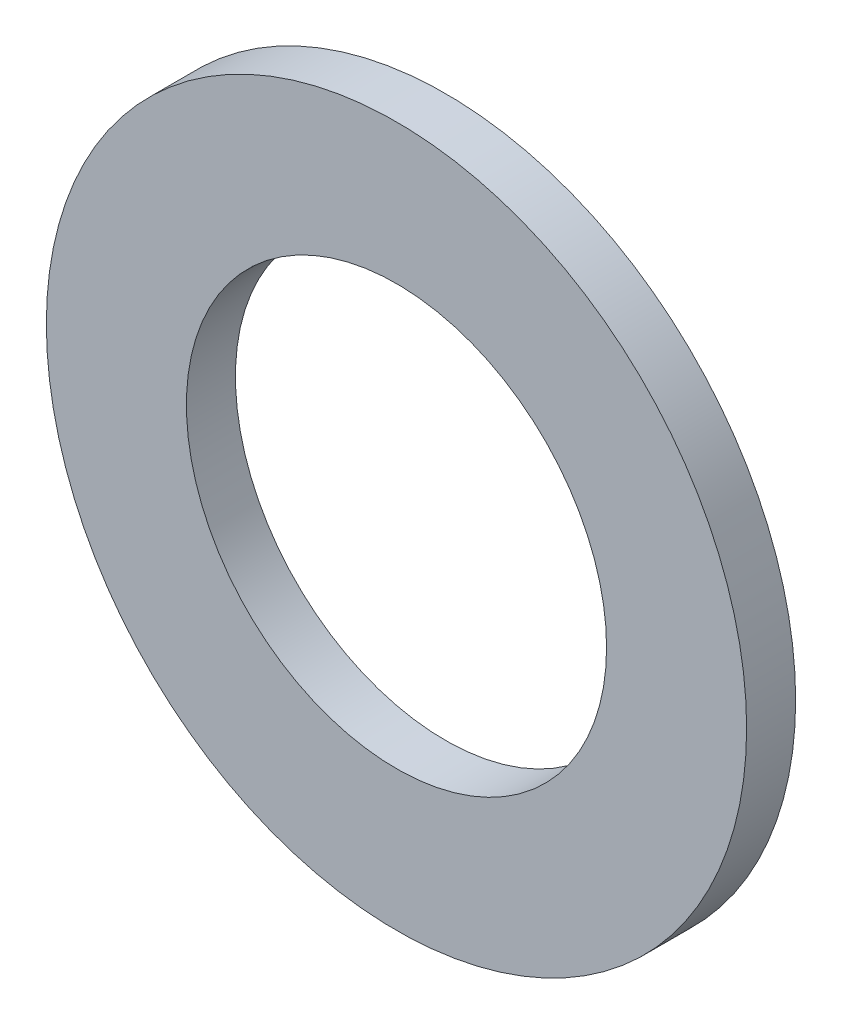
ISO-10303-21;
HEADER;
FILE_DESCRIPTION(('STEP AP214'),'2;1');
FILE_NAME('part.step','',(''),(''),'','','');
FILE_SCHEMA(('AUTOMOTIVE_DESIGN { 1 0 10303 214 1 1 1 1 }'));
ENDSEC;
DATA;
#1=APPLICATION_CONTEXT('core data for automotive mechanical design processes');
#2=APPLICATION_PROTOCOL_DEFINITION('international standard','automotive_design',2000,#1);
#3=PRODUCT_CONTEXT('',#1,'mechanical');
#4=PRODUCT('Part','Part','',(#3));
#5=PRODUCT_RELATED_PRODUCT_CATEGORY('part','',(#4));
#6=PRODUCT_DEFINITION_FORMATION('','',#4);
#7=PRODUCT_DEFINITION_CONTEXT('part definition',#1,'design');
#8=PRODUCT_DEFINITION('design','',#6,#7);
#9=PRODUCT_DEFINITION_SHAPE('','',#8);
#10=(LENGTH_UNIT() NAMED_UNIT(*) SI_UNIT(.MILLI.,.METRE.));
#11=(NAMED_UNIT(*) PLANE_ANGLE_UNIT() SI_UNIT($,.RADIAN.));
#12=(NAMED_UNIT(*) SI_UNIT($,.STERADIAN.) SOLID_ANGLE_UNIT());
#13=UNCERTAINTY_MEASURE_WITH_UNIT(LENGTH_MEASURE(1.E-05),#10,'distance_accuracy_value','');
#14=(GEOMETRIC_REPRESENTATION_CONTEXT(3) GLOBAL_UNCERTAINTY_ASSIGNED_CONTEXT((#13)) GLOBAL_UNIT_ASSIGNED_CONTEXT((#10,
#11,#12)) REPRESENTATION_CONTEXT('',''));
#15=CARTESIAN_POINT('',(0.,0.,0.));
#16=DIRECTION('',(0.,0.,1.));
#17=DIRECTION('',(1.,0.,0.));
#18=AXIS2_PLACEMENT_3D('',#15,#16,#17);
#19=CARTESIAN_POINT('',(0.,0.,1.4));
#20=DIRECTION('',(0.,0.,1.));
#21=DIRECTION('',(1.,0.,0.));
#22=AXIS2_PLACEMENT_3D('',#19,#20,#21);
#23=PLANE('',#22);
#24=CARTESIAN_POINT('',(0.,0.,1.4));
#25=DIRECTION('',(0.,0.,1.));
#26=DIRECTION('',(1.,0.,0.));
#27=AXIS2_PLACEMENT_3D('',#24,#25,#26);
#28=CIRCLE('',#27,10.);
#29=CARTESIAN_POINT('',(10.,0.,1.4));
#30=VERTEX_POINT('',#29);
#31=EDGE_CURVE('E10',#30,#30,#28,.T.);
#32=ORIENTED_EDGE('',*,*,#31,.T.);
#33=EDGE_LOOP('',(#32));
#34=FACE_BOUND('',#33,.T.);
#35=CARTESIAN_POINT('',(0.,0.,1.4));
#36=DIRECTION('',(0.,0.,1.));
#37=DIRECTION('',(1.,0.,0.));
#38=AXIS2_PLACEMENT_3D('',#35,#36,#37);
#39=CIRCLE('',#38,6.);
#40=CARTESIAN_POINT('',(6.,0.,1.4));
#41=VERTEX_POINT('',#40);
#42=EDGE_CURVE('E43',#41,#41,#39,.T.);
#43=ORIENTED_EDGE('',*,*,#42,.F.);
#44=EDGE_LOOP('',(#43));
#45=FACE_BOUND('',#44,.T.);
#46=ADVANCED_FACE('F32',(#34,#45),#23,.T.);
#47=CARTESIAN_POINT('',(0.,0.,0.));
#48=DIRECTION('',(0.,0.,1.));
#49=DIRECTION('',(1.,0.,0.));
#50=AXIS2_PLACEMENT_3D('',#47,#48,#49);
#51=PLANE('',#50);
#52=CARTESIAN_POINT('',(0.,0.,0.));
#53=DIRECTION('',(0.,0.,1.));
#54=DIRECTION('',(1.,0.,0.));
#55=AXIS2_PLACEMENT_3D('',#52,#53,#54);
#56=CIRCLE('',#55,10.);
#57=CARTESIAN_POINT('',(10.,0.,0.));
#58=VERTEX_POINT('',#57);
#59=EDGE_CURVE('E36',#58,#58,#56,.T.);
#60=ORIENTED_EDGE('',*,*,#59,.F.);
#61=EDGE_LOOP('',(#60));
#62=FACE_BOUND('',#61,.T.);
#63=CARTESIAN_POINT('',(0.,0.,0.));
#64=DIRECTION('',(0.,0.,1.));
#65=DIRECTION('',(1.,0.,0.));
#66=AXIS2_PLACEMENT_3D('',#63,#64,#65);
#67=CIRCLE('',#66,6.);
#68=CARTESIAN_POINT('',(6.,0.,0.));
#69=VERTEX_POINT('',#68);
#70=EDGE_CURVE('E45',#69,#69,#67,.T.);
#71=ORIENTED_EDGE('',*,*,#70,.T.);
#72=EDGE_LOOP('',(#71));
#73=FACE_BOUND('',#72,.T.);
#74=ADVANCED_FACE('F55',(#62,#73),#51,.F.);
#75=CARTESIAN_POINT('',(0.,0.,1.4));
#76=DIRECTION('',(0.,0.,-1.));
#77=DIRECTION('',(-1.,0.,0.));
#78=AXIS2_PLACEMENT_3D('',#75,#76,#77);
#79=CYLINDRICAL_SURFACE('',#78,10.);
#80=ORIENTED_EDGE('',*,*,#31,.F.);
#81=EDGE_LOOP('',(#80));
#82=FACE_BOUND('',#81,.T.);
#83=ORIENTED_EDGE('',*,*,#59,.T.);
#84=EDGE_LOOP('',(#83));
#85=FACE_BOUND('',#84,.T.);
#86=ADVANCED_FACE('F34',(#82,#85),#79,.T.);
#87=CARTESIAN_POINT('',(0.,0.,1.4));
#88=DIRECTION('',(0.,0.,-1.));
#89=DIRECTION('',(-1.,0.,0.));
#90=AXIS2_PLACEMENT_3D('',#87,#88,#89);
#91=CYLINDRICAL_SURFACE('',#90,6.);
#92=ORIENTED_EDGE('',*,*,#42,.T.);
#93=EDGE_LOOP('',(#92));
#94=FACE_BOUND('',#93,.T.);
#95=ORIENTED_EDGE('',*,*,#70,.F.);
#96=EDGE_LOOP('',(#95));
#97=FACE_BOUND('',#96,.T.);
#98=ADVANCED_FACE('F51',(#94,#97),#91,.F.);
#99=CLOSED_SHELL('',(#46,#74,#86,#98));
#100=MANIFOLD_SOLID_BREP('B2',#99);
#101=ADVANCED_BREP_SHAPE_REPRESENTATION('',(#18,#100),#14);
#102=SHAPE_DEFINITION_REPRESENTATION(#9,#101);
ENDSEC;
END-ISO-10303-21;
